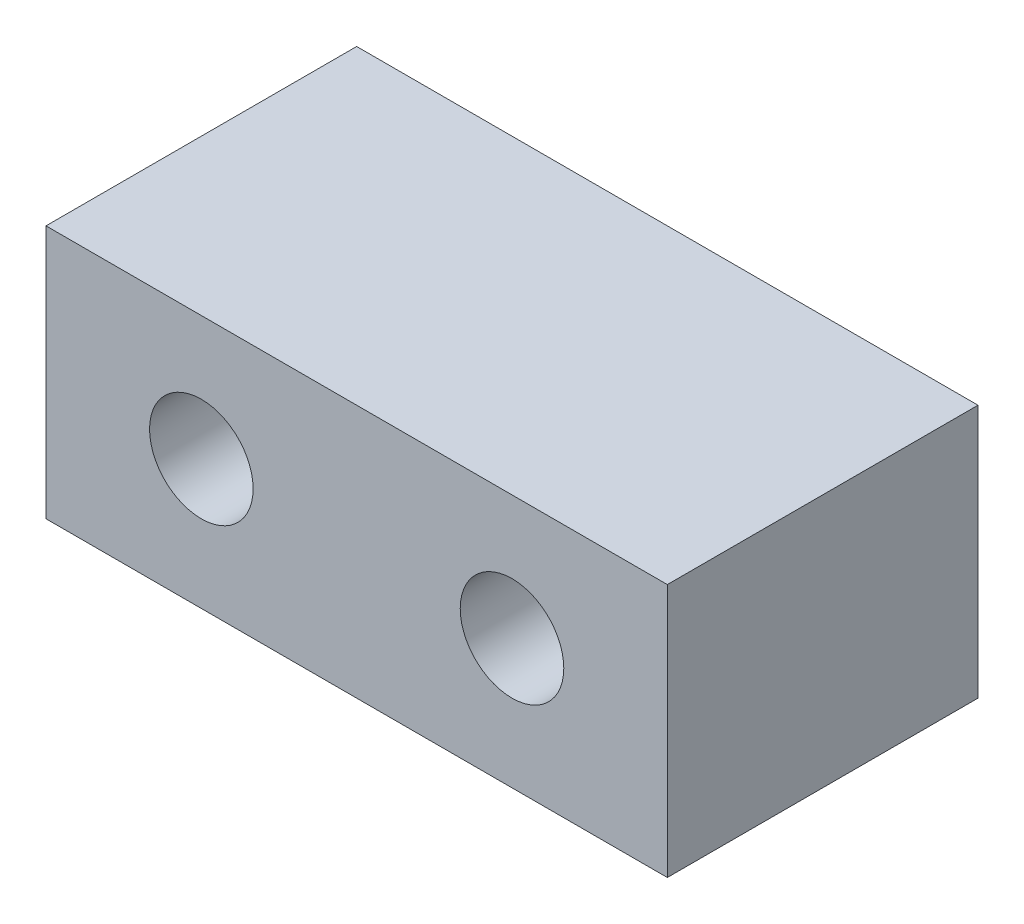
ISO-10303-21;
HEADER;
FILE_DESCRIPTION(('STEP AP214'),'2;1');
FILE_NAME('part.step','',(''),(''),'','','');
FILE_SCHEMA(('AUTOMOTIVE_DESIGN { 1 0 10303 214 1 1 1 1 }'));
ENDSEC;
DATA;
#1=APPLICATION_CONTEXT('core data for automotive mechanical design processes');
#2=APPLICATION_PROTOCOL_DEFINITION('international standard','automotive_design',2000,#1);
#3=PRODUCT_CONTEXT('',#1,'mechanical');
#4=PRODUCT('Part','Part','',(#3));
#5=PRODUCT_RELATED_PRODUCT_CATEGORY('part','',(#4));
#6=PRODUCT_DEFINITION_FORMATION('','',#4);
#7=PRODUCT_DEFINITION_CONTEXT('part definition',#1,'design');
#8=PRODUCT_DEFINITION('design','',#6,#7);
#9=PRODUCT_DEFINITION_SHAPE('','',#8);
#10=(LENGTH_UNIT() NAMED_UNIT(*) SI_UNIT(.MILLI.,.METRE.));
#11=(NAMED_UNIT(*) PLANE_ANGLE_UNIT() SI_UNIT($,.RADIAN.));
#12=(NAMED_UNIT(*) SI_UNIT($,.STERADIAN.) SOLID_ANGLE_UNIT());
#13=UNCERTAINTY_MEASURE_WITH_UNIT(LENGTH_MEASURE(1.E-05),#10,'distance_accuracy_value','');
#14=(GEOMETRIC_REPRESENTATION_CONTEXT(3) GLOBAL_UNCERTAINTY_ASSIGNED_CONTEXT((#13)) GLOBAL_UNIT_ASSIGNED_CONTEXT((#10,
#11,#12)) REPRESENTATION_CONTEXT('',''));
#15=CARTESIAN_POINT('',(0.,0.,0.));
#16=DIRECTION('',(0.,0.,1.));
#17=DIRECTION('',(1.,0.,0.));
#18=AXIS2_PLACEMENT_3D('',#15,#16,#17);
#19=CARTESIAN_POINT('',(7.50000000000001,1.35,15.));
#20=DIRECTION('',(0.,0.,-1.));
#21=DIRECTION('',(-1.,0.,0.));
#22=AXIS2_PLACEMENT_3D('',#19,#20,#21);
#23=CYLINDRICAL_SURFACE('',#22,2.5);
#24=CARTESIAN_POINT('',(7.50000000000001,1.35,15.));
#25=DIRECTION('',(0.,0.,1.));
#26=DIRECTION('',(1.,0.,0.));
#27=AXIS2_PLACEMENT_3D('',#24,#25,#26);
#28=CIRCLE('',#27,2.5);
#29=CARTESIAN_POINT('',(10.,1.35,15.));
#30=VERTEX_POINT('',#29);
#31=EDGE_CURVE('E107',#30,#30,#28,.T.);
#32=ORIENTED_EDGE('',*,*,#31,.T.);
#33=EDGE_LOOP('',(#32));
#34=FACE_BOUND('',#33,.T.);
#35=CARTESIAN_POINT('',(7.50000000000001,1.35,6.));
#36=DIRECTION('',(0.,0.,-1.));
#37=DIRECTION('',(-1.,0.,0.));
#38=AXIS2_PLACEMENT_3D('',#35,#36,#37);
#39=CIRCLE('',#38,2.5);
#40=CARTESIAN_POINT('',(5.,1.35,6.));
#41=VERTEX_POINT('',#40);
#42=EDGE_CURVE('E100',#41,#41,#39,.T.);
#43=ORIENTED_EDGE('',*,*,#42,.T.);
#44=EDGE_LOOP('',(#43));
#45=FACE_BOUND('',#44,.T.);
#46=ADVANCED_FACE('F33',(#34,#45),#23,.F.);
#47=CARTESIAN_POINT('',(-7.49999999999999,1.35,15.));
#48=DIRECTION('',(0.,0.,-1.));
#49=DIRECTION('',(-1.,0.,0.));
#50=AXIS2_PLACEMENT_3D('',#47,#48,#49);
#51=CYLINDRICAL_SURFACE('',#50,2.5);
#52=CARTESIAN_POINT('',(-7.49999999999999,1.35,15.));
#53=DIRECTION('',(0.,0.,1.));
#54=DIRECTION('',(1.,0.,0.));
#55=AXIS2_PLACEMENT_3D('',#52,#53,#54);
#56=CIRCLE('',#55,2.5);
#57=CARTESIAN_POINT('',(-4.99999999999999,1.35,15.));
#58=VERTEX_POINT('',#57);
#59=EDGE_CURVE('E103',#58,#58,#56,.T.);
#60=ORIENTED_EDGE('',*,*,#59,.T.);
#61=EDGE_LOOP('',(#60));
#62=FACE_BOUND('',#61,.T.);
#63=CARTESIAN_POINT('',(-7.49999999999999,1.35,6.));
#64=DIRECTION('',(0.,0.,-1.));
#65=DIRECTION('',(-1.,0.,0.));
#66=AXIS2_PLACEMENT_3D('',#63,#64,#65);
#67=CIRCLE('',#66,2.5);
#68=CARTESIAN_POINT('',(-9.99999999999999,1.35,6.));
#69=VERTEX_POINT('',#68);
#70=EDGE_CURVE('E98',#69,#69,#67,.T.);
#71=ORIENTED_EDGE('',*,*,#70,.T.);
#72=EDGE_LOOP('',(#71));
#73=FACE_BOUND('',#72,.T.);
#74=ADVANCED_FACE('F151',(#62,#73),#51,.F.);
#75=CARTESIAN_POINT('',(0.,0.,15.));
#76=DIRECTION('',(0.,0.,-1.));
#77=DIRECTION('',(-1.,0.,0.));
#78=AXIS2_PLACEMENT_3D('',#75,#76,#77);
#79=PLANE('',#78);
#80=DIRECTION('',(0.,-1.,0.));
#81=VECTOR('',#80,1.);
#82=CARTESIAN_POINT('',(-15.,-7.35,15.));
#83=LINE('',#82,#81);
#84=CARTESIAN_POINT('',(-15.,7.35,15.));
#85=VERTEX_POINT('',#84);
#86=CARTESIAN_POINT('',(-15.,-4.9,15.));
#87=VERTEX_POINT('',#86);
#88=EDGE_CURVE('E85',#85,#87,#83,.T.);
#89=ORIENTED_EDGE('',*,*,#88,.T.);
#90=DIRECTION('',(1.,0.,0.));
#91=VECTOR('',#90,1.);
#92=CARTESIAN_POINT('',(19.1804792103554,-4.9,15.));
#93=LINE('',#92,#91);
#94=CARTESIAN_POINT('',(15.,-4.9,15.));
#95=VERTEX_POINT('',#94);
#96=EDGE_CURVE('E48',#87,#95,#93,.T.);
#97=ORIENTED_EDGE('',*,*,#96,.T.);
#98=DIRECTION('',(0.,1.,0.));
#99=VECTOR('',#98,1.);
#100=CARTESIAN_POINT('',(15.,-7.35,15.));
#101=LINE('',#100,#99);
#102=CARTESIAN_POINT('',(15.,7.35,15.));
#103=VERTEX_POINT('',#102);
#104=EDGE_CURVE('E92',#95,#103,#101,.T.);
#105=ORIENTED_EDGE('',*,*,#104,.T.);
#106=DIRECTION('',(-1.,0.,0.));
#107=VECTOR('',#106,1.);
#108=CARTESIAN_POINT('',(-15.,7.35,15.));
#109=LINE('',#108,#107);
#110=EDGE_CURVE('E56',#103,#85,#109,.T.);
#111=ORIENTED_EDGE('',*,*,#110,.T.);
#112=EDGE_LOOP('',(#89,#97,#105,#111));
#113=FACE_BOUND('',#112,.T.);
#114=ORIENTED_EDGE('',*,*,#31,.F.);
#115=EDGE_LOOP('',(#114));
#116=FACE_BOUND('',#115,.T.);
#117=ORIENTED_EDGE('',*,*,#59,.F.);
#118=EDGE_LOOP('',(#117));
#119=FACE_BOUND('',#118,.T.);
#120=ADVANCED_FACE('F126',(#113,#116,#119),#79,.F.);
#121=CARTESIAN_POINT('',(0.,0.,0.));
#122=DIRECTION('',(0.,0.,-1.));
#123=DIRECTION('',(-1.,0.,0.));
#124=AXIS2_PLACEMENT_3D('',#121,#122,#123);
#125=PLANE('',#124);
#126=DIRECTION('',(1.,0.,0.));
#127=VECTOR('',#126,1.);
#128=CARTESIAN_POINT('',(19.1804792103554,-4.9,0.));
#129=LINE('',#128,#127);
#130=CARTESIAN_POINT('',(-15.,-4.9,0.));
#131=VERTEX_POINT('',#130);
#132=CARTESIAN_POINT('',(15.,-4.9,0.));
#133=VERTEX_POINT('',#132);
#134=EDGE_CURVE('E91',#131,#133,#129,.T.);
#135=ORIENTED_EDGE('',*,*,#134,.F.);
#136=DIRECTION('',(0.,-1.,0.));
#137=VECTOR('',#136,1.);
#138=CARTESIAN_POINT('',(-15.,-7.35,0.));
#139=LINE('',#138,#137);
#140=CARTESIAN_POINT('',(-15.,7.35,0.));
#141=VERTEX_POINT('',#140);
#142=EDGE_CURVE('E78',#141,#131,#139,.T.);
#143=ORIENTED_EDGE('',*,*,#142,.F.);
#144=DIRECTION('',(-1.,0.,0.));
#145=VECTOR('',#144,1.);
#146=CARTESIAN_POINT('',(-15.,7.35,0.));
#147=LINE('',#146,#145);
#148=CARTESIAN_POINT('',(15.,7.35,0.));
#149=VERTEX_POINT('',#148);
#150=EDGE_CURVE('E69',#149,#141,#147,.T.);
#151=ORIENTED_EDGE('',*,*,#150,.F.);
#152=DIRECTION('',(0.,1.,0.));
#153=VECTOR('',#152,1.);
#154=CARTESIAN_POINT('',(15.,-7.35,0.));
#155=LINE('',#154,#153);
#156=EDGE_CURVE('E79',#133,#149,#155,.T.);
#157=ORIENTED_EDGE('',*,*,#156,.F.);
#158=EDGE_LOOP('',(#135,#143,#151,#157));
#159=FACE_BOUND('',#158,.T.);
#160=CARTESIAN_POINT('',(7.50000000000001,1.35,0.));
#161=DIRECTION('',(0.,0.,-1.));
#162=DIRECTION('',(-1.,0.,0.));
#163=AXIS2_PLACEMENT_3D('',#160,#161,#162);
#164=CIRCLE('',#163,4.5);
#165=CARTESIAN_POINT('',(3.00000000000001,1.35,0.));
#166=VERTEX_POINT('',#165);
#167=EDGE_CURVE('E134',#166,#166,#164,.T.);
#168=ORIENTED_EDGE('',*,*,#167,.F.);
#169=EDGE_LOOP('',(#168));
#170=FACE_BOUND('',#169,.T.);
#171=CARTESIAN_POINT('',(-7.49999999999999,1.35,0.));
#172=DIRECTION('',(0.,0.,-1.));
#173=DIRECTION('',(-1.,0.,0.));
#174=AXIS2_PLACEMENT_3D('',#171,#172,#173);
#175=CIRCLE('',#174,4.5);
#176=CARTESIAN_POINT('',(-12.,1.35,0.));
#177=VERTEX_POINT('',#176);
#178=EDGE_CURVE('E114',#177,#177,#175,.T.);
#179=ORIENTED_EDGE('',*,*,#178,.F.);
#180=EDGE_LOOP('',(#179));
#181=FACE_BOUND('',#180,.T.);
#182=ADVANCED_FACE('F88',(#159,#170,#181),#125,.T.);
#183=CARTESIAN_POINT('',(15.,-7.35,15.));
#184=DIRECTION('',(-1.,0.,0.));
#185=DIRECTION('',(0.,0.,1.));
#186=AXIS2_PLACEMENT_3D('',#183,#184,#185);
#187=PLANE('',#186);
#188=ORIENTED_EDGE('',*,*,#104,.F.);
#189=DIRECTION('',(0.,0.,-1.));
#190=VECTOR('',#189,1.);
#191=CARTESIAN_POINT('',(15.,-4.9,15.));
#192=LINE('',#191,#190);
#193=EDGE_CURVE('E122',#95,#133,#192,.T.);
#194=ORIENTED_EDGE('',*,*,#193,.T.);
#195=ORIENTED_EDGE('',*,*,#156,.T.);
#196=DIRECTION('',(0.,0.,-1.));
#197=VECTOR('',#196,1.);
#198=CARTESIAN_POINT('',(15.,7.35,15.));
#199=LINE('',#198,#197);
#200=EDGE_CURVE('E41',#103,#149,#199,.T.);
#201=ORIENTED_EDGE('',*,*,#200,.F.);
#202=EDGE_LOOP('',(#188,#194,#195,#201));
#203=FACE_BOUND('',#202,.T.);
#204=ADVANCED_FACE('F35',(#203),#187,.F.);
#205=CARTESIAN_POINT('',(-15.,7.35,15.));
#206=DIRECTION('',(0.,-1.,0.));
#207=DIRECTION('',(0.,0.,-1.));
#208=AXIS2_PLACEMENT_3D('',#205,#206,#207);
#209=PLANE('',#208);
#210=ORIENTED_EDGE('',*,*,#150,.T.);
#211=DIRECTION('',(0.,0.,-1.));
#212=VECTOR('',#211,1.);
#213=CARTESIAN_POINT('',(-15.,7.35,15.));
#214=LINE('',#213,#212);
#215=EDGE_CURVE('E72',#85,#141,#214,.T.);
#216=ORIENTED_EDGE('',*,*,#215,.F.);
#217=ORIENTED_EDGE('',*,*,#110,.F.);
#218=ORIENTED_EDGE('',*,*,#200,.T.);
#219=EDGE_LOOP('',(#210,#216,#217,#218));
#220=FACE_BOUND('',#219,.T.);
#221=ADVANCED_FACE('F71',(#220),#209,.F.);
#222=CARTESIAN_POINT('',(-15.,-7.35,15.));
#223=DIRECTION('',(1.,0.,0.));
#224=DIRECTION('',(0.,0.,-1.));
#225=AXIS2_PLACEMENT_3D('',#222,#223,#224);
#226=PLANE('',#225);
#227=ORIENTED_EDGE('',*,*,#142,.T.);
#228=DIRECTION('',(0.,0.,1.));
#229=VECTOR('',#228,1.);
#230=CARTESIAN_POINT('',(-15.,-4.9,15.));
#231=LINE('',#230,#229);
#232=EDGE_CURVE('E11',#131,#87,#231,.T.);
#233=ORIENTED_EDGE('',*,*,#232,.T.);
#234=ORIENTED_EDGE('',*,*,#88,.F.);
#235=ORIENTED_EDGE('',*,*,#215,.T.);
#236=EDGE_LOOP('',(#227,#233,#234,#235));
#237=FACE_BOUND('',#236,.T.);
#238=ADVANCED_FACE('F83',(#237),#226,.F.);
#239=CARTESIAN_POINT('',(-7.49999999999999,1.35,6.));
#240=DIRECTION('',(0.,0.,-1.));
#241=DIRECTION('',(-1.,0.,0.));
#242=AXIS2_PLACEMENT_3D('',#239,#240,#241);
#243=CYLINDRICAL_SURFACE('',#242,4.5);
#244=CARTESIAN_POINT('',(-7.49999999999999,1.35,6.));
#245=DIRECTION('',(0.,0.,-1.));
#246=DIRECTION('',(-1.,0.,0.));
#247=AXIS2_PLACEMENT_3D('',#244,#245,#246);
#248=CIRCLE('',#247,4.5);
#249=CARTESIAN_POINT('',(-12.,1.35,6.));
#250=VERTEX_POINT('',#249);
#251=EDGE_CURVE('E136',#250,#250,#248,.T.);
#252=ORIENTED_EDGE('',*,*,#251,.F.);
#253=EDGE_LOOP('',(#252));
#254=FACE_BOUND('',#253,.T.);
#255=ORIENTED_EDGE('',*,*,#178,.T.);
#256=EDGE_LOOP('',(#255));
#257=FACE_BOUND('',#256,.T.);
#258=ADVANCED_FACE('F143',(#254,#257),#243,.F.);
#259=CARTESIAN_POINT('',(-7.49999999999999,1.35,6.));
#260=DIRECTION('',(0.,0.,-1.));
#261=DIRECTION('',(-1.,0.,0.));
#262=AXIS2_PLACEMENT_3D('',#259,#260,#261);
#263=PLANE('',#262);
#264=ORIENTED_EDGE('',*,*,#70,.F.);
#265=EDGE_LOOP('',(#264));
#266=FACE_BOUND('',#265,.T.);
#267=ORIENTED_EDGE('',*,*,#251,.T.);
#268=EDGE_LOOP('',(#267));
#269=FACE_BOUND('',#268,.T.);
#270=ADVANCED_FACE('F164',(#266,#269),#263,.T.);
#271=CARTESIAN_POINT('',(7.50000000000001,1.35,6.));
#272=DIRECTION('',(0.,0.,-1.));
#273=DIRECTION('',(-1.,0.,0.));
#274=AXIS2_PLACEMENT_3D('',#271,#272,#273);
#275=CYLINDRICAL_SURFACE('',#274,4.5);
#276=CARTESIAN_POINT('',(7.50000000000001,1.35,6.));
#277=DIRECTION('',(0.,0.,-1.));
#278=DIRECTION('',(-1.,0.,0.));
#279=AXIS2_PLACEMENT_3D('',#276,#277,#278);
#280=CIRCLE('',#279,4.5);
#281=CARTESIAN_POINT('',(3.00000000000001,1.35,6.));
#282=VERTEX_POINT('',#281);
#283=EDGE_CURVE('E101',#282,#282,#280,.T.);
#284=ORIENTED_EDGE('',*,*,#283,.F.);
#285=EDGE_LOOP('',(#284));
#286=FACE_BOUND('',#285,.T.);
#287=ORIENTED_EDGE('',*,*,#167,.T.);
#288=EDGE_LOOP('',(#287));
#289=FACE_BOUND('',#288,.T.);
#290=ADVANCED_FACE('F168',(#286,#289),#275,.F.);
#291=CARTESIAN_POINT('',(7.50000000000001,1.35,6.));
#292=DIRECTION('',(0.,0.,-1.));
#293=DIRECTION('',(-1.,0.,0.));
#294=AXIS2_PLACEMENT_3D('',#291,#292,#293);
#295=PLANE('',#294);
#296=ORIENTED_EDGE('',*,*,#42,.F.);
#297=EDGE_LOOP('',(#296));
#298=FACE_BOUND('',#297,.T.);
#299=ORIENTED_EDGE('',*,*,#283,.T.);
#300=EDGE_LOOP('',(#299));
#301=FACE_BOUND('',#300,.T.);
#302=ADVANCED_FACE('F172',(#298,#301),#295,.T.);
#303=CARTESIAN_POINT('',(19.1804792103554,-4.9,15.));
#304=DIRECTION('',(0.,1.,0.));
#305=DIRECTION('',(0.,0.,1.));
#306=AXIS2_PLACEMENT_3D('',#303,#304,#305);
#307=PLANE('',#306);
#308=ORIENTED_EDGE('',*,*,#96,.F.);
#309=ORIENTED_EDGE('',*,*,#232,.F.);
#310=ORIENTED_EDGE('',*,*,#134,.T.);
#311=ORIENTED_EDGE('',*,*,#193,.F.);
#312=EDGE_LOOP('',(#308,#309,#310,#311));
#313=FACE_BOUND('',#312,.T.);
#314=ADVANCED_FACE('F125',(#313),#307,.F.);
#315=CLOSED_SHELL('',(#46,#74,#120,#182,#204,#221,#238,#258,#270,#290,#302,#314));
#316=MANIFOLD_SOLID_BREP('B2',#315);
#317=ADVANCED_BREP_SHAPE_REPRESENTATION('',(#18,#316),#14);
#318=SHAPE_DEFINITION_REPRESENTATION(#9,#317);
ENDSEC;
END-ISO-10303-21;
